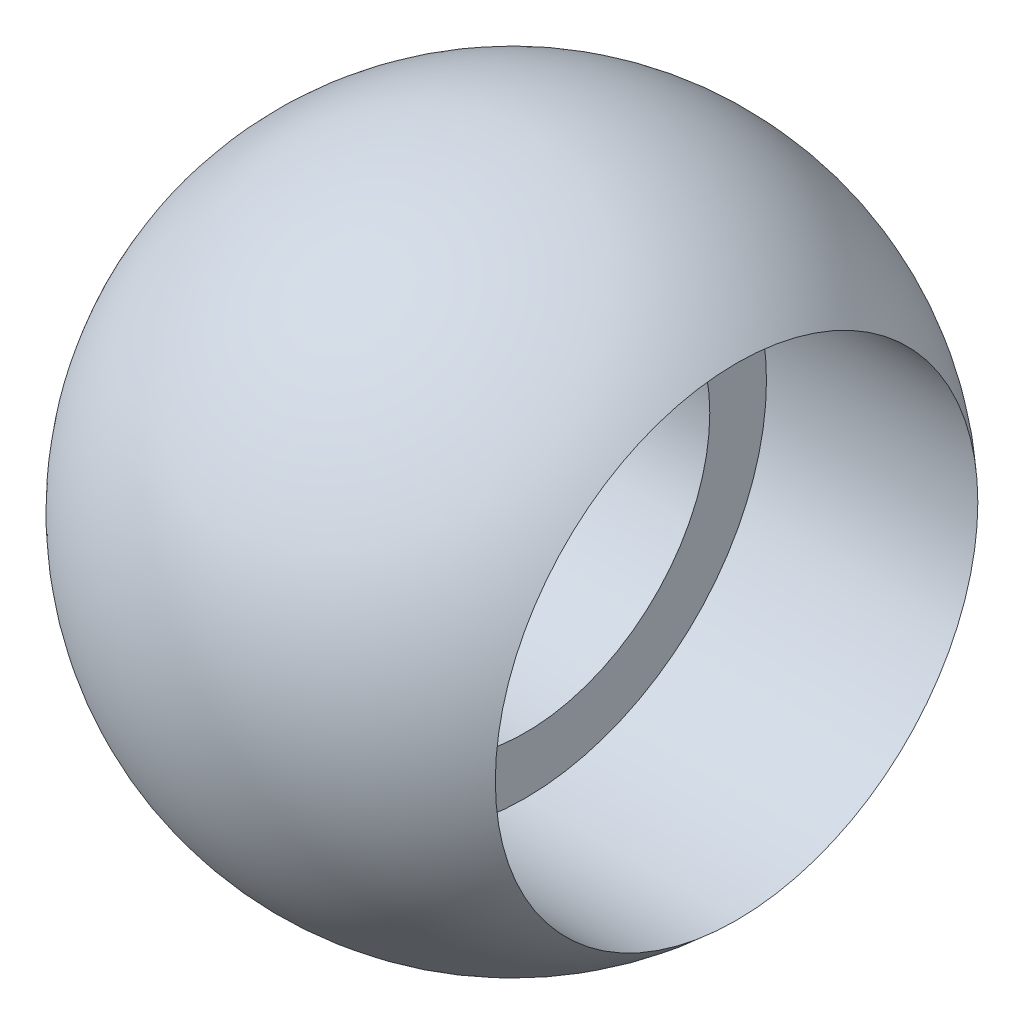
ISO-10303-21;
HEADER;
FILE_DESCRIPTION(('STEP AP214'),'2;1');
FILE_NAME('part.step','',(''),(''),'','','');
FILE_SCHEMA(('AUTOMOTIVE_DESIGN { 1 0 10303 214 1 1 1 1 }'));
ENDSEC;
DATA;
#1=APPLICATION_CONTEXT('core data for automotive mechanical design processes');
#2=APPLICATION_PROTOCOL_DEFINITION('international standard','automotive_design',2000,#1);
#3=PRODUCT_CONTEXT('',#1,'mechanical');
#4=PRODUCT('Part','Part','',(#3));
#5=PRODUCT_RELATED_PRODUCT_CATEGORY('part','',(#4));
#6=PRODUCT_DEFINITION_FORMATION('','',#4);
#7=PRODUCT_DEFINITION_CONTEXT('part definition',#1,'design');
#8=PRODUCT_DEFINITION('design','',#6,#7);
#9=PRODUCT_DEFINITION_SHAPE('','',#8);
#10=(LENGTH_UNIT() NAMED_UNIT(*) SI_UNIT(.MILLI.,.METRE.));
#11=(NAMED_UNIT(*) PLANE_ANGLE_UNIT() SI_UNIT($,.RADIAN.));
#12=(NAMED_UNIT(*) SI_UNIT($,.STERADIAN.) SOLID_ANGLE_UNIT());
#13=UNCERTAINTY_MEASURE_WITH_UNIT(LENGTH_MEASURE(1.E-05),#10,'distance_accuracy_value','');
#14=(GEOMETRIC_REPRESENTATION_CONTEXT(3) GLOBAL_UNCERTAINTY_ASSIGNED_CONTEXT((#13)) GLOBAL_UNIT_ASSIGNED_CONTEXT((#10,
#11,#12)) REPRESENTATION_CONTEXT('',''));
#15=CARTESIAN_POINT('',(0.,0.,0.));
#16=DIRECTION('',(0.,0.,1.));
#17=DIRECTION('',(1.,0.,0.));
#18=AXIS2_PLACEMENT_3D('',#15,#16,#17);
#19=CARTESIAN_POINT('',(-3.175,0.,0.));
#20=DIRECTION('',(1.,0.,0.));
#21=DIRECTION('',(0.,0.,-1.));
#22=AXIS2_PLACEMENT_3D('',#19,#20,#21);
#23=CYLINDRICAL_SURFACE('',#22,1.778);
#24=CARTESIAN_POINT('',(-2.63046402750541,0.,0.));
#25=DIRECTION('',(1.,0.,0.));
#26=DIRECTION('',(0.,0.,-1.));
#27=AXIS2_PLACEMENT_3D('',#24,#25,#26);
#28=CIRCLE('',#27,1.778);
#29=CARTESIAN_POINT('',(-2.63046402750541,0.,-1.778));
#30=VERTEX_POINT('',#29);
#31=EDGE_CURVE('E10',#30,#30,#28,.T.);
#32=ORIENTED_EDGE('',*,*,#31,.F.);
#33=EDGE_LOOP('',(#32));
#34=FACE_BOUND('',#33,.T.);
#35=CARTESIAN_POINT('',(0.127000000000001,0.,0.));
#36=DIRECTION('',(1.,0.,0.));
#37=DIRECTION('',(0.,0.,-1.));
#38=AXIS2_PLACEMENT_3D('',#35,#36,#37);
#39=CIRCLE('',#38,1.778);
#40=CARTESIAN_POINT('',(0.127000000000001,0.,-1.778));
#41=VERTEX_POINT('',#40);
#42=EDGE_CURVE('E46',#41,#41,#39,.F.);
#43=ORIENTED_EDGE('',*,*,#42,.F.);
#44=EDGE_LOOP('',(#43));
#45=FACE_BOUND('',#44,.T.);
#46=ADVANCED_FACE('F34',(#34,#45),#23,.F.);
#47=CARTESIAN_POINT('',(0.,0.,0.));
#48=DIRECTION('',(0.,0.,-1.));
#49=DIRECTION('',(1.,0.,0.));
#50=AXIS2_PLACEMENT_3D('',#47,#48,#49);
#51=SPHERICAL_SURFACE('',#50,3.175);
#52=CARTESIAN_POINT('',(0.,0.,0.));
#53=DIRECTION('',(-1.,0.,0.));
#54=DIRECTION('',(0.,0.,1.));
#55=AXIS2_PLACEMENT_3D('',#52,#53,#54);
#56=SPHERICAL_SURFACE('',#55,3.175);
#57=CARTESIAN_POINT('',(2.16314220290761,0.,0.));
#58=DIRECTION('',(-1.,0.,0.));
#59=DIRECTION('',(0.,0.,1.));
#60=AXIS2_PLACEMENT_3D('',#57,#58,#59);
#61=CIRCLE('',#60,2.3241);
#62=CARTESIAN_POINT('',(2.16314220290761,0.,-2.3241));
#63=VERTEX_POINT('',#62);
#64=EDGE_CURVE('E38',#63,#63,#61,.T.);
#65=ORIENTED_EDGE('',*,*,#64,.T.);
#66=EDGE_LOOP('',(#65));
#67=FACE_BOUND('',#66,.T.);
#68=ORIENTED_EDGE('',*,*,#31,.T.);
#69=EDGE_LOOP('',(#68));
#70=FACE_BOUND('',#69,.T.);
#71=ADVANCED_FACE('F36',(#67,#70),#56,.T.);
#72=CARTESIAN_POINT('',(0.127000000000001,0.,0.));
#73=DIRECTION('',(1.,0.,0.));
#74=DIRECTION('',(0.,0.,-1.));
#75=AXIS2_PLACEMENT_3D('',#72,#73,#74);
#76=CYLINDRICAL_SURFACE('',#75,2.3241);
#77=CARTESIAN_POINT('',(0.127000000000001,0.,0.));
#78=DIRECTION('',(1.,0.,0.));
#79=DIRECTION('',(0.,0.,-1.));
#80=AXIS2_PLACEMENT_3D('',#77,#78,#79);
#81=CIRCLE('',#80,2.3241);
#82=CARTESIAN_POINT('',(0.127000000000001,0.,-2.3241));
#83=VERTEX_POINT('',#82);
#84=EDGE_CURVE('E48',#83,#83,#81,.T.);
#85=CARTESIAN_POINT('',(0.127000000000001,0.,-2.3241));
#86=CARTESIAN_POINT('',(0.148209814613622,0.,-2.3241));
#87=CARTESIAN_POINT('',(0.169419629227243,0.,-2.3241));
#88=CARTESIAN_POINT('',(0.211839258454485,0.,-2.3241));
#89=CARTESIAN_POINT('',(0.233049073068106,0.,-2.3241));
#90=CARTESIAN_POINT('',(0.275468702295348,0.,-2.3241));
#91=CARTESIAN_POINT('',(0.296678516908969,0.,-2.3241));
#92=CARTESIAN_POINT('',(0.339098146136211,0.,-2.3241));
#93=CARTESIAN_POINT('',(0.360307960749832,0.,-2.3241));
#94=CARTESIAN_POINT('',(0.402727589977074,0.,-2.3241));
#95=CARTESIAN_POINT('',(0.423937404590695,0.,-2.3241));
#96=CARTESIAN_POINT('',(0.466357033817937,0.,-2.3241));
#97=CARTESIAN_POINT('',(0.487566848431558,0.,-2.3241));
#98=CARTESIAN_POINT('',(0.5299864776588,0.,-2.3241));
#99=CARTESIAN_POINT('',(0.551196292272421,0.,-2.3241));
#100=CARTESIAN_POINT('',(0.593615921499662,0.,-2.3241));
#101=CARTESIAN_POINT('',(0.614825736113283,0.,-2.3241));
#102=CARTESIAN_POINT('',(0.657245365340525,0.,-2.3241));
#103=CARTESIAN_POINT('',(0.678455179954146,0.,-2.3241));
#104=CARTESIAN_POINT('',(0.720874809181388,0.,-2.3241));
#105=CARTESIAN_POINT('',(0.742084623795009,0.,-2.3241));
#106=CARTESIAN_POINT('',(0.784504253022251,0.,-2.3241));
#107=CARTESIAN_POINT('',(0.805714067635872,0.,-2.3241));
#108=CARTESIAN_POINT('',(0.848133696863114,0.,-2.3241));
#109=CARTESIAN_POINT('',(0.869343511476735,0.,-2.3241));
#110=CARTESIAN_POINT('',(0.911763140703977,0.,-2.3241));
#111=CARTESIAN_POINT('',(0.932972955317598,0.,-2.3241));
#112=CARTESIAN_POINT('',(0.97539258454484,0.,-2.3241));
#113=CARTESIAN_POINT('',(0.996602399158461,0.,-2.3241));
#114=CARTESIAN_POINT('',(1.0390220283857,0.,-2.3241));
#115=CARTESIAN_POINT('',(1.06023184299932,0.,-2.3241));
#116=CARTESIAN_POINT('',(1.10265147222657,0.,-2.3241));
#117=CARTESIAN_POINT('',(1.12386128684019,0.,-2.3241));
#118=CARTESIAN_POINT('',(1.16628091606743,0.,-2.3241));
#119=CARTESIAN_POINT('',(1.18749073068105,0.,-2.3241));
#120=CARTESIAN_POINT('',(1.22991035990829,0.,-2.3241));
#121=CARTESIAN_POINT('',(1.25112017452191,0.,-2.3241));
#122=CARTESIAN_POINT('',(1.29353980374915,0.,-2.3241));
#123=CARTESIAN_POINT('',(1.31474961836278,0.,-2.3241));
#124=CARTESIAN_POINT('',(1.35716924759002,0.,-2.3241));
#125=CARTESIAN_POINT('',(1.37837906220364,0.,-2.3241));
#126=CARTESIAN_POINT('',(1.42079869143088,0.,-2.3241));
#127=CARTESIAN_POINT('',(1.4420085060445,0.,-2.3241));
#128=CARTESIAN_POINT('',(1.48442813527174,0.,-2.3241));
#129=CARTESIAN_POINT('',(1.50563794988536,0.,-2.3241));
#130=CARTESIAN_POINT('',(1.54805757911261,0.,-2.3241));
#131=CARTESIAN_POINT('',(1.56926739372623,0.,-2.3241));
#132=CARTESIAN_POINT('',(1.61168702295347,0.,-2.3241));
#133=CARTESIAN_POINT('',(1.63289683756709,0.,-2.3241));
#134=CARTESIAN_POINT('',(1.67531646679433,0.,-2.3241));
#135=CARTESIAN_POINT('',(1.69652628140795,0.,-2.3241));
#136=CARTESIAN_POINT('',(1.73894591063519,0.,-2.3241));
#137=CARTESIAN_POINT('',(1.76015572524882,0.,-2.3241));
#138=CARTESIAN_POINT('',(1.80257535447606,0.,-2.3241));
#139=CARTESIAN_POINT('',(1.82378516908968,0.,-2.3241));
#140=CARTESIAN_POINT('',(1.86620479831692,0.,-2.3241));
#141=CARTESIAN_POINT('',(1.88741461293054,0.,-2.3241));
#142=CARTESIAN_POINT('',(1.92983424215778,0.,-2.3241));
#143=CARTESIAN_POINT('',(1.9510440567714,0.,-2.3241));
#144=CARTESIAN_POINT('',(1.99346368599865,0.,-2.3241));
#145=CARTESIAN_POINT('',(2.01467350061227,0.,-2.3241));
#146=CARTESIAN_POINT('',(2.05709312983951,0.,-2.3241));
#147=CARTESIAN_POINT('',(2.07830294445313,0.,-2.3241));
#148=CARTESIAN_POINT('',(2.12072257368037,0.,-2.3241));
#149=CARTESIAN_POINT('',(2.14193238829399,0.,-2.3241));
#150=CARTESIAN_POINT('',(2.16314220290761,0.,-2.3241));
#151=B_SPLINE_CURVE_WITH_KNOTS('',3,(#85,#86,#87,#88,#89,#90,#91,#92,#93,#94,#95,#96,#97,#98,
#99,#100,#101,#102,#103,#104,#105,#106,#107,#108,#109,#110,#111,#112,#113,#114,#115,#116,#117,
#118,#119,#120,#121,#122,#123,#124,#125,#126,#127,#128,#129,#130,#131,#132,#133,#134,#135,#136,
#137,#138,#139,#140,#141,#142,#143,#144,#145,#146,#147,#148,#149,#150),.UNSPECIFIED.,.F.,.F.,(4,
2,2,2,2,2,2,2,2,2,2,2,2,2,2,2,2,2,2,2,2,2,2,2,2,2,2,2,2,2,2,2,4),(0.,0.0636294438408629,
0.127258887681726,0.190888331522589,0.254517775363452,0.318147219204314,0.381776663045177,
0.44540610688604,0.509035550726903,0.572664994567766,0.636294438408629,0.699923882249492,
0.763553326090355,0.827182769931218,0.890812213772081,0.954441657612944,1.01807110145381,
1.08170054529467,1.14532998913553,1.20895943297639,1.27258887681726,1.33621832065812,
1.39984776449898,1.46347720833985,1.52710665218071,1.59073609602157,1.65436553986244,
1.7179949837033,1.78162442754416,1.84525387138502,1.90888331522589,1.97251275906675,
2.03614220290761),.UNSPECIFIED.);
#152=EDGE_CURVE('BSEAM57',#83,#63,#151,.T.);
#153=ORIENTED_EDGE('',*,*,#84,.F.);
#154=ORIENTED_EDGE('',*,*,#64,.F.);
#155=ORIENTED_EDGE('',*,*,#152,.T.);
#156=ORIENTED_EDGE('',*,*,#152,.F.);
#157=EDGE_LOOP('',(#153,#155,#154,#156));
#158=FACE_BOUND('',#157,.T.);
#159=ADVANCED_FACE('F57',(#158),#76,.F.);
#160=CARTESIAN_POINT('',(0.127000000000001,0.,0.));
#161=DIRECTION('',(1.,0.,0.));
#162=DIRECTION('',(0.,0.,-1.));
#163=AXIS2_PLACEMENT_3D('',#160,#161,#162);
#164=PLANE('',#163);
#165=ORIENTED_EDGE('',*,*,#84,.T.);
#166=EDGE_LOOP('',(#165));
#167=FACE_BOUND('',#166,.T.);
#168=ORIENTED_EDGE('',*,*,#42,.T.);
#169=EDGE_LOOP('',(#168));
#170=FACE_BOUND('',#169,.T.);
#171=ADVANCED_FACE('F55',(#167,#170),#164,.T.);
#172=CLOSED_SHELL('',(#46,#71,#159,#171));
#173=MANIFOLD_SOLID_BREP('B2',#172);
#174=ADVANCED_BREP_SHAPE_REPRESENTATION('',(#18,#173),#14);
#175=SHAPE_DEFINITION_REPRESENTATION(#9,#174);
ENDSEC;
END-ISO-10303-21;
